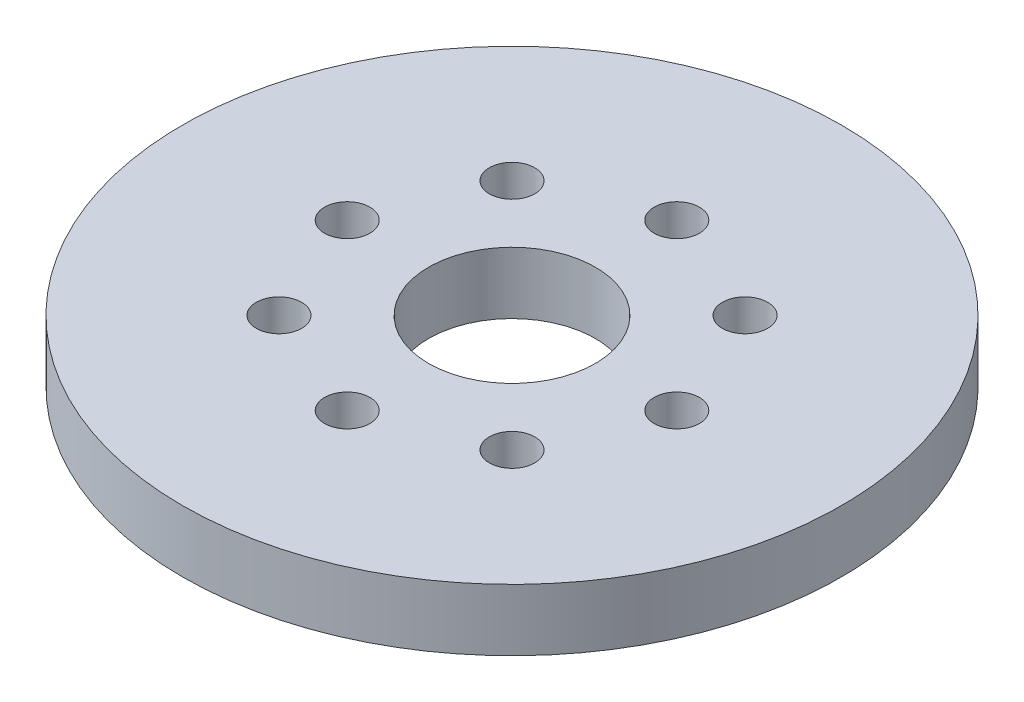
ISO-10303-21;
HEADER;
FILE_DESCRIPTION(('STEP AP214'),'2;1');
FILE_NAME('part.step','',(''),(''),'','','');
FILE_SCHEMA(('AUTOMOTIVE_DESIGN { 1 0 10303 214 1 1 1 1 }'));
ENDSEC;
DATA;
#1=APPLICATION_CONTEXT('core data for automotive mechanical design processes');
#2=APPLICATION_PROTOCOL_DEFINITION('international standard','automotive_design',2000,#1);
#3=PRODUCT_CONTEXT('',#1,'mechanical');
#4=PRODUCT('Part','Part','',(#3));
#5=PRODUCT_RELATED_PRODUCT_CATEGORY('part','',(#4));
#6=PRODUCT_DEFINITION_FORMATION('','',#4);
#7=PRODUCT_DEFINITION_CONTEXT('part definition',#1,'design');
#8=PRODUCT_DEFINITION('design','',#6,#7);
#9=PRODUCT_DEFINITION_SHAPE('','',#8);
#10=(LENGTH_UNIT() NAMED_UNIT(*) SI_UNIT(.MILLI.,.METRE.));
#11=(NAMED_UNIT(*) PLANE_ANGLE_UNIT() SI_UNIT($,.RADIAN.));
#12=(NAMED_UNIT(*) SI_UNIT($,.STERADIAN.) SOLID_ANGLE_UNIT());
#13=UNCERTAINTY_MEASURE_WITH_UNIT(LENGTH_MEASURE(1.E-05),#10,'distance_accuracy_value','');
#14=(GEOMETRIC_REPRESENTATION_CONTEXT(3) GLOBAL_UNCERTAINTY_ASSIGNED_CONTEXT((#13)) GLOBAL_UNIT_ASSIGNED_CONTEXT((#10,
#11,#12)) REPRESENTATION_CONTEXT('',''));
#15=CARTESIAN_POINT('',(0.,0.,0.));
#16=DIRECTION('',(0.,0.,1.));
#17=DIRECTION('',(1.,0.,0.));
#18=AXIS2_PLACEMENT_3D('',#15,#16,#17);
#19=CARTESIAN_POINT('',(0.,3.,0.));
#20=DIRECTION('',(0.,1.,0.));
#21=DIRECTION('',(0.,0.,1.));
#22=AXIS2_PLACEMENT_3D('',#19,#20,#21);
#23=PLANE('',#22);
#24=CARTESIAN_POINT('',(-8.,3.,0.));
#25=DIRECTION('',(0.,1.,0.));
#26=DIRECTION('',(0.,0.,1.));
#27=AXIS2_PLACEMENT_3D('',#24,#25,#26);
#28=CIRCLE('',#27,1.1);
#29=CARTESIAN_POINT('',(-8.,3.,1.1));
#30=VERTEX_POINT('',#29);
#31=EDGE_CURVE('E85',#30,#30,#28,.T.);
#32=ORIENTED_EDGE('',*,*,#31,.F.);
#33=EDGE_LOOP('',(#32));
#34=FACE_BOUND('',#33,.T.);
#35=CARTESIAN_POINT('',(0.,3.,8.));
#36=DIRECTION('',(0.,1.,0.));
#37=DIRECTION('',(0.,0.,1.));
#38=AXIS2_PLACEMENT_3D('',#35,#36,#37);
#39=CIRCLE('',#38,1.1);
#40=CARTESIAN_POINT('',(0.,3.,9.1));
#41=VERTEX_POINT('',#40);
#42=EDGE_CURVE('E73',#41,#41,#39,.T.);
#43=ORIENTED_EDGE('',*,*,#42,.F.);
#44=EDGE_LOOP('',(#43));
#45=FACE_BOUND('',#44,.T.);
#46=CARTESIAN_POINT('',(8.,3.,0.));
#47=DIRECTION('',(0.,1.,0.));
#48=DIRECTION('',(0.,0.,1.));
#49=AXIS2_PLACEMENT_3D('',#46,#47,#48);
#50=CIRCLE('',#49,1.1);
#51=CARTESIAN_POINT('',(8.,3.,1.1));
#52=VERTEX_POINT('',#51);
#53=EDGE_CURVE('E61',#52,#52,#50,.T.);
#54=ORIENTED_EDGE('',*,*,#53,.F.);
#55=EDGE_LOOP('',(#54));
#56=FACE_BOUND('',#55,.T.);
#57=CARTESIAN_POINT('',(0.,3.,-8.));
#58=DIRECTION('',(0.,1.,0.));
#59=DIRECTION('',(0.,0.,1.));
#60=AXIS2_PLACEMENT_3D('',#57,#58,#59);
#61=CIRCLE('',#60,1.1);
#62=CARTESIAN_POINT('',(0.,3.,-6.9));
#63=VERTEX_POINT('',#62);
#64=EDGE_CURVE('E49',#63,#63,#61,.T.);
#65=ORIENTED_EDGE('',*,*,#64,.F.);
#66=EDGE_LOOP('',(#65));
#67=FACE_BOUND('',#66,.T.);
#68=CARTESIAN_POINT('',(0.,3.,0.));
#69=DIRECTION('',(0.,1.,0.));
#70=DIRECTION('',(0.,0.,1.));
#71=AXIS2_PLACEMENT_3D('',#68,#69,#70);
#72=CIRCLE('',#71,16.);
#73=CARTESIAN_POINT('',(0.,3.,16.));
#74=VERTEX_POINT('',#73);
#75=EDGE_CURVE('E10',#74,#74,#72,.T.);
#76=ORIENTED_EDGE('',*,*,#75,.T.);
#77=EDGE_LOOP('',(#76));
#78=FACE_BOUND('',#77,.T.);
#79=CARTESIAN_POINT('',(0.,3.,0.));
#80=DIRECTION('',(0.,1.,0.));
#81=DIRECTION('',(0.,0.,1.));
#82=AXIS2_PLACEMENT_3D('',#79,#80,#81);
#83=CIRCLE('',#82,4.05);
#84=CARTESIAN_POINT('',(0.,3.,4.05));
#85=VERTEX_POINT('',#84);
#86=EDGE_CURVE('E44',#85,#85,#83,.T.);
#87=ORIENTED_EDGE('',*,*,#86,.F.);
#88=EDGE_LOOP('',(#87));
#89=FACE_BOUND('',#88,.T.);
#90=CARTESIAN_POINT('',(5.65685424949238,3.,-5.65685424949238));
#91=DIRECTION('',(0.,1.,0.));
#92=DIRECTION('',(0.,0.,1.));
#93=AXIS2_PLACEMENT_3D('',#90,#91,#92);
#94=CIRCLE('',#93,1.1);
#95=CARTESIAN_POINT('',(5.65685424949238,3.,-4.55685424949238));
#96=VERTEX_POINT('',#95);
#97=EDGE_CURVE('E55',#96,#96,#94,.T.);
#98=ORIENTED_EDGE('',*,*,#97,.F.);
#99=EDGE_LOOP('',(#98));
#100=FACE_BOUND('',#99,.T.);
#101=CARTESIAN_POINT('',(5.65685424949238,3.,5.65685424949238));
#102=DIRECTION('',(0.,1.,0.));
#103=DIRECTION('',(0.,0.,1.));
#104=AXIS2_PLACEMENT_3D('',#101,#102,#103);
#105=CIRCLE('',#104,1.1);
#106=CARTESIAN_POINT('',(5.65685424949238,3.,6.75685424949238));
#107=VERTEX_POINT('',#106);
#108=EDGE_CURVE('E67',#107,#107,#105,.T.);
#109=ORIENTED_EDGE('',*,*,#108,.F.);
#110=EDGE_LOOP('',(#109));
#111=FACE_BOUND('',#110,.T.);
#112=CARTESIAN_POINT('',(-5.65685424949238,3.,5.65685424949238));
#113=DIRECTION('',(0.,1.,0.));
#114=DIRECTION('',(0.,0.,1.));
#115=AXIS2_PLACEMENT_3D('',#112,#113,#114);
#116=CIRCLE('',#115,1.1);
#117=CARTESIAN_POINT('',(-5.65685424949238,3.,6.75685424949238));
#118=VERTEX_POINT('',#117);
#119=EDGE_CURVE('E79',#118,#118,#116,.T.);
#120=ORIENTED_EDGE('',*,*,#119,.F.);
#121=EDGE_LOOP('',(#120));
#122=FACE_BOUND('',#121,.T.);
#123=CARTESIAN_POINT('',(-5.65685424949238,3.,-5.65685424949238));
#124=DIRECTION('',(0.,1.,0.));
#125=DIRECTION('',(0.,0.,1.));
#126=AXIS2_PLACEMENT_3D('',#123,#124,#125);
#127=CIRCLE('',#126,1.1);
#128=CARTESIAN_POINT('',(-5.65685424949238,3.,-4.55685424949238));
#129=VERTEX_POINT('',#128);
#130=EDGE_CURVE('E91',#129,#129,#127,.T.);
#131=ORIENTED_EDGE('',*,*,#130,.F.);
#132=EDGE_LOOP('',(#131));
#133=FACE_BOUND('',#132,.T.);
#134=ADVANCED_FACE('F33',(#34,#45,#56,#67,#78,#89,#100,#111,#122,#133),#23,.T.);
#135=CARTESIAN_POINT('',(0.,0.,0.));
#136=DIRECTION('',(0.,1.,0.));
#137=DIRECTION('',(0.,0.,1.));
#138=AXIS2_PLACEMENT_3D('',#135,#136,#137);
#139=PLANE('',#138);
#140=CARTESIAN_POINT('',(0.,0.,0.));
#141=DIRECTION('',(0.,1.,0.));
#142=DIRECTION('',(0.,0.,1.));
#143=AXIS2_PLACEMENT_3D('',#140,#141,#142);
#144=CIRCLE('',#143,16.);
#145=CARTESIAN_POINT('',(0.,0.,16.));
#146=VERTEX_POINT('',#145);
#147=EDGE_CURVE('E37',#146,#146,#144,.T.);
#148=ORIENTED_EDGE('',*,*,#147,.F.);
#149=EDGE_LOOP('',(#148));
#150=FACE_BOUND('',#149,.T.);
#151=CARTESIAN_POINT('',(0.,0.,0.));
#152=DIRECTION('',(0.,1.,0.));
#153=DIRECTION('',(0.,0.,1.));
#154=AXIS2_PLACEMENT_3D('',#151,#152,#153);
#155=CIRCLE('',#154,4.05);
#156=CARTESIAN_POINT('',(0.,0.,4.05));
#157=VERTEX_POINT('',#156);
#158=EDGE_CURVE('E46',#157,#157,#155,.T.);
#159=ORIENTED_EDGE('',*,*,#158,.T.);
#160=EDGE_LOOP('',(#159));
#161=FACE_BOUND('',#160,.T.);
#162=CARTESIAN_POINT('',(0.,0.,-8.));
#163=DIRECTION('',(0.,1.,0.));
#164=DIRECTION('',(0.,0.,1.));
#165=AXIS2_PLACEMENT_3D('',#162,#163,#164);
#166=CIRCLE('',#165,1.1);
#167=CARTESIAN_POINT('',(0.,0.,-6.9));
#168=VERTEX_POINT('',#167);
#169=EDGE_CURVE('E52',#168,#168,#166,.T.);
#170=ORIENTED_EDGE('',*,*,#169,.T.);
#171=EDGE_LOOP('',(#170));
#172=FACE_BOUND('',#171,.T.);
#173=CARTESIAN_POINT('',(5.65685424949238,0.,-5.65685424949238));
#174=DIRECTION('',(0.,1.,0.));
#175=DIRECTION('',(0.,0.,1.));
#176=AXIS2_PLACEMENT_3D('',#173,#174,#175);
#177=CIRCLE('',#176,1.1);
#178=CARTESIAN_POINT('',(5.65685424949238,0.,-4.55685424949238));
#179=VERTEX_POINT('',#178);
#180=EDGE_CURVE('E58',#179,#179,#177,.T.);
#181=ORIENTED_EDGE('',*,*,#180,.T.);
#182=EDGE_LOOP('',(#181));
#183=FACE_BOUND('',#182,.T.);
#184=CARTESIAN_POINT('',(8.,0.,0.));
#185=DIRECTION('',(0.,1.,0.));
#186=DIRECTION('',(0.,0.,1.));
#187=AXIS2_PLACEMENT_3D('',#184,#185,#186);
#188=CIRCLE('',#187,1.1);
#189=CARTESIAN_POINT('',(8.,0.,1.1));
#190=VERTEX_POINT('',#189);
#191=EDGE_CURVE('E64',#190,#190,#188,.T.);
#192=ORIENTED_EDGE('',*,*,#191,.T.);
#193=EDGE_LOOP('',(#192));
#194=FACE_BOUND('',#193,.T.);
#195=CARTESIAN_POINT('',(5.65685424949238,0.,5.65685424949238));
#196=DIRECTION('',(0.,1.,0.));
#197=DIRECTION('',(0.,0.,1.));
#198=AXIS2_PLACEMENT_3D('',#195,#196,#197);
#199=CIRCLE('',#198,1.1);
#200=CARTESIAN_POINT('',(5.65685424949238,0.,6.75685424949238));
#201=VERTEX_POINT('',#200);
#202=EDGE_CURVE('E70',#201,#201,#199,.T.);
#203=ORIENTED_EDGE('',*,*,#202,.T.);
#204=EDGE_LOOP('',(#203));
#205=FACE_BOUND('',#204,.T.);
#206=CARTESIAN_POINT('',(0.,0.,8.));
#207=DIRECTION('',(0.,1.,0.));
#208=DIRECTION('',(0.,0.,1.));
#209=AXIS2_PLACEMENT_3D('',#206,#207,#208);
#210=CIRCLE('',#209,1.1);
#211=CARTESIAN_POINT('',(0.,0.,9.1));
#212=VERTEX_POINT('',#211);
#213=EDGE_CURVE('E76',#212,#212,#210,.T.);
#214=ORIENTED_EDGE('',*,*,#213,.T.);
#215=EDGE_LOOP('',(#214));
#216=FACE_BOUND('',#215,.T.);
#217=CARTESIAN_POINT('',(-5.65685424949238,0.,5.65685424949238));
#218=DIRECTION('',(0.,1.,0.));
#219=DIRECTION('',(0.,0.,1.));
#220=AXIS2_PLACEMENT_3D('',#217,#218,#219);
#221=CIRCLE('',#220,1.1);
#222=CARTESIAN_POINT('',(-5.65685424949238,0.,6.75685424949238));
#223=VERTEX_POINT('',#222);
#224=EDGE_CURVE('E82',#223,#223,#221,.T.);
#225=ORIENTED_EDGE('',*,*,#224,.T.);
#226=EDGE_LOOP('',(#225));
#227=FACE_BOUND('',#226,.T.);
#228=CARTESIAN_POINT('',(-8.,0.,0.));
#229=DIRECTION('',(0.,1.,0.));
#230=DIRECTION('',(0.,0.,1.));
#231=AXIS2_PLACEMENT_3D('',#228,#229,#230);
#232=CIRCLE('',#231,1.1);
#233=CARTESIAN_POINT('',(-8.,0.,1.1));
#234=VERTEX_POINT('',#233);
#235=EDGE_CURVE('E88',#234,#234,#232,.T.);
#236=ORIENTED_EDGE('',*,*,#235,.T.);
#237=EDGE_LOOP('',(#236));
#238=FACE_BOUND('',#237,.T.);
#239=CARTESIAN_POINT('',(-5.65685424949238,0.,-5.65685424949238));
#240=DIRECTION('',(0.,1.,0.));
#241=DIRECTION('',(0.,0.,1.));
#242=AXIS2_PLACEMENT_3D('',#239,#240,#241);
#243=CIRCLE('',#242,1.1);
#244=CARTESIAN_POINT('',(-5.65685424949238,0.,-4.55685424949238));
#245=VERTEX_POINT('',#244);
#246=EDGE_CURVE('E94',#245,#245,#243,.T.);
#247=ORIENTED_EDGE('',*,*,#246,.T.);
#248=EDGE_LOOP('',(#247));
#249=FACE_BOUND('',#248,.T.);
#250=ADVANCED_FACE('F104',(#150,#161,#172,#183,#194,#205,#216,#227,#238,#249),#139,.F.);
#251=CARTESIAN_POINT('',(0.,3.,0.));
#252=DIRECTION('',(0.,-1.,0.));
#253=DIRECTION('',(0.,0.,-1.));
#254=AXIS2_PLACEMENT_3D('',#251,#252,#253);
#255=CYLINDRICAL_SURFACE('',#254,16.);
#256=ORIENTED_EDGE('',*,*,#75,.F.);
#257=EDGE_LOOP('',(#256));
#258=FACE_BOUND('',#257,.T.);
#259=ORIENTED_EDGE('',*,*,#147,.T.);
#260=EDGE_LOOP('',(#259));
#261=FACE_BOUND('',#260,.T.);
#262=ADVANCED_FACE('F35',(#258,#261),#255,.T.);
#263=CARTESIAN_POINT('',(0.,3.,0.));
#264=DIRECTION('',(0.,-1.,0.));
#265=DIRECTION('',(0.,0.,-1.));
#266=AXIS2_PLACEMENT_3D('',#263,#264,#265);
#267=CYLINDRICAL_SURFACE('',#266,4.05);
#268=ORIENTED_EDGE('',*,*,#86,.T.);
#269=EDGE_LOOP('',(#268));
#270=FACE_BOUND('',#269,.T.);
#271=ORIENTED_EDGE('',*,*,#158,.F.);
#272=EDGE_LOOP('',(#271));
#273=FACE_BOUND('',#272,.T.);
#274=ADVANCED_FACE('F114',(#270,#273),#267,.F.);
#275=CARTESIAN_POINT('',(0.,3.,-8.));
#276=DIRECTION('',(0.,-1.,0.));
#277=DIRECTION('',(0.,0.,-1.));
#278=AXIS2_PLACEMENT_3D('',#275,#276,#277);
#279=CYLINDRICAL_SURFACE('',#278,1.1);
#280=ORIENTED_EDGE('',*,*,#64,.T.);
#281=EDGE_LOOP('',(#280));
#282=FACE_BOUND('',#281,.T.);
#283=ORIENTED_EDGE('',*,*,#169,.F.);
#284=EDGE_LOOP('',(#283));
#285=FACE_BOUND('',#284,.T.);
#286=ADVANCED_FACE('F117',(#282,#285),#279,.F.);
#287=CARTESIAN_POINT('',(5.65685424949238,3.,-5.65685424949238));
#288=DIRECTION('',(0.,-1.,0.));
#289=DIRECTION('',(0.,0.,-1.));
#290=AXIS2_PLACEMENT_3D('',#287,#288,#289);
#291=CYLINDRICAL_SURFACE('',#290,1.1);
#292=ORIENTED_EDGE('',*,*,#97,.T.);
#293=EDGE_LOOP('',(#292));
#294=FACE_BOUND('',#293,.T.);
#295=ORIENTED_EDGE('',*,*,#180,.F.);
#296=EDGE_LOOP('',(#295));
#297=FACE_BOUND('',#296,.T.);
#298=ADVANCED_FACE('F121',(#294,#297),#291,.F.);
#299=CARTESIAN_POINT('',(8.,3.,0.));
#300=DIRECTION('',(0.,-1.,0.));
#301=DIRECTION('',(0.,0.,-1.));
#302=AXIS2_PLACEMENT_3D('',#299,#300,#301);
#303=CYLINDRICAL_SURFACE('',#302,1.1);
#304=ORIENTED_EDGE('',*,*,#53,.T.);
#305=EDGE_LOOP('',(#304));
#306=FACE_BOUND('',#305,.T.);
#307=ORIENTED_EDGE('',*,*,#191,.F.);
#308=EDGE_LOOP('',(#307));
#309=FACE_BOUND('',#308,.T.);
#310=ADVANCED_FACE('F125',(#306,#309),#303,.F.);
#311=CARTESIAN_POINT('',(5.65685424949238,3.,5.65685424949238));
#312=DIRECTION('',(0.,-1.,0.));
#313=DIRECTION('',(0.,0.,-1.));
#314=AXIS2_PLACEMENT_3D('',#311,#312,#313);
#315=CYLINDRICAL_SURFACE('',#314,1.1);
#316=ORIENTED_EDGE('',*,*,#108,.T.);
#317=EDGE_LOOP('',(#316));
#318=FACE_BOUND('',#317,.T.);
#319=ORIENTED_EDGE('',*,*,#202,.F.);
#320=EDGE_LOOP('',(#319));
#321=FACE_BOUND('',#320,.T.);
#322=ADVANCED_FACE('F129',(#318,#321),#315,.F.);
#323=CARTESIAN_POINT('',(0.,3.,8.));
#324=DIRECTION('',(0.,-1.,0.));
#325=DIRECTION('',(0.,0.,-1.));
#326=AXIS2_PLACEMENT_3D('',#323,#324,#325);
#327=CYLINDRICAL_SURFACE('',#326,1.1);
#328=ORIENTED_EDGE('',*,*,#42,.T.);
#329=EDGE_LOOP('',(#328));
#330=FACE_BOUND('',#329,.T.);
#331=ORIENTED_EDGE('',*,*,#213,.F.);
#332=EDGE_LOOP('',(#331));
#333=FACE_BOUND('',#332,.T.);
#334=ADVANCED_FACE('F133',(#330,#333),#327,.F.);
#335=CARTESIAN_POINT('',(-5.65685424949238,3.,5.65685424949238));
#336=DIRECTION('',(0.,-1.,0.));
#337=DIRECTION('',(0.,0.,-1.));
#338=AXIS2_PLACEMENT_3D('',#335,#336,#337);
#339=CYLINDRICAL_SURFACE('',#338,1.1);
#340=ORIENTED_EDGE('',*,*,#119,.T.);
#341=EDGE_LOOP('',(#340));
#342=FACE_BOUND('',#341,.T.);
#343=ORIENTED_EDGE('',*,*,#224,.F.);
#344=EDGE_LOOP('',(#343));
#345=FACE_BOUND('',#344,.T.);
#346=ADVANCED_FACE('F137',(#342,#345),#339,.F.);
#347=CARTESIAN_POINT('',(-8.,3.,0.));
#348=DIRECTION('',(0.,-1.,0.));
#349=DIRECTION('',(0.,0.,-1.));
#350=AXIS2_PLACEMENT_3D('',#347,#348,#349);
#351=CYLINDRICAL_SURFACE('',#350,1.1);
#352=ORIENTED_EDGE('',*,*,#31,.T.);
#353=EDGE_LOOP('',(#352));
#354=FACE_BOUND('',#353,.T.);
#355=ORIENTED_EDGE('',*,*,#235,.F.);
#356=EDGE_LOOP('',(#355));
#357=FACE_BOUND('',#356,.T.);
#358=ADVANCED_FACE('F141',(#354,#357),#351,.F.);
#359=CARTESIAN_POINT('',(-5.65685424949238,3.,-5.65685424949238));
#360=DIRECTION('',(0.,-1.,0.));
#361=DIRECTION('',(0.,0.,-1.));
#362=AXIS2_PLACEMENT_3D('',#359,#360,#361);
#363=CYLINDRICAL_SURFACE('',#362,1.1);
#364=ORIENTED_EDGE('',*,*,#130,.T.);
#365=EDGE_LOOP('',(#364));
#366=FACE_BOUND('',#365,.T.);
#367=ORIENTED_EDGE('',*,*,#246,.F.);
#368=EDGE_LOOP('',(#367));
#369=FACE_BOUND('',#368,.T.);
#370=ADVANCED_FACE('F100',(#366,#369),#363,.F.);
#371=CLOSED_SHELL('',(#134,#250,#262,#274,#286,#298,#310,#322,#334,#346,#358,#370));
#372=MANIFOLD_SOLID_BREP('B2',#371);
#373=ADVANCED_BREP_SHAPE_REPRESENTATION('',(#18,#372),#14);
#374=SHAPE_DEFINITION_REPRESENTATION(#9,#373);
ENDSEC;
END-ISO-10303-21;
